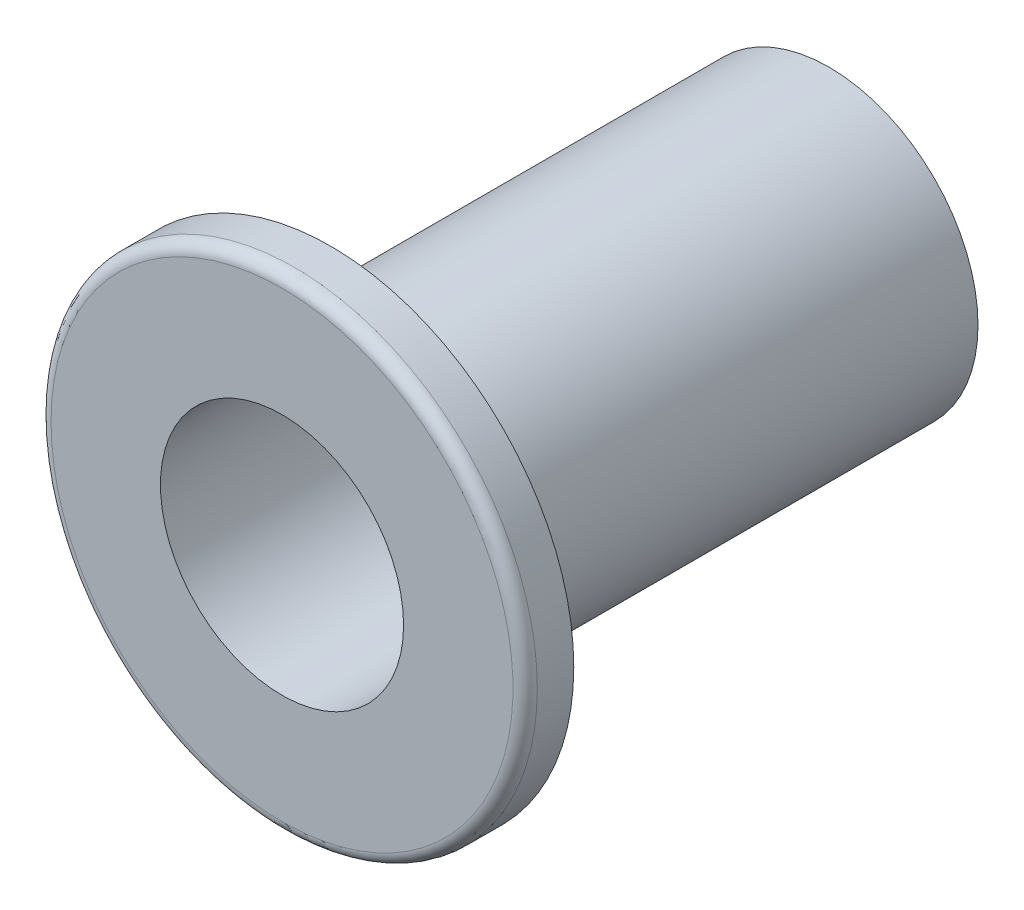
ISO-10303-21;
HEADER;
FILE_DESCRIPTION(('STEP AP214'),'2;1');
FILE_NAME('part.step','',(''),(''),'','','');
FILE_SCHEMA(('AUTOMOTIVE_DESIGN { 1 0 10303 214 1 1 1 1 }'));
ENDSEC;
DATA;
#1=APPLICATION_CONTEXT('core data for automotive mechanical design processes');
#2=APPLICATION_PROTOCOL_DEFINITION('international standard','automotive_design',2000,#1);
#3=PRODUCT_CONTEXT('',#1,'mechanical');
#4=PRODUCT('Part','Part','',(#3));
#5=PRODUCT_RELATED_PRODUCT_CATEGORY('part','',(#4));
#6=PRODUCT_DEFINITION_FORMATION('','',#4);
#7=PRODUCT_DEFINITION_CONTEXT('part definition',#1,'design');
#8=PRODUCT_DEFINITION('design','',#6,#7);
#9=PRODUCT_DEFINITION_SHAPE('','',#8);
#10=(LENGTH_UNIT() NAMED_UNIT(*) SI_UNIT(.MILLI.,.METRE.));
#11=(NAMED_UNIT(*) PLANE_ANGLE_UNIT() SI_UNIT($,.RADIAN.));
#12=(NAMED_UNIT(*) SI_UNIT($,.STERADIAN.) SOLID_ANGLE_UNIT());
#13=UNCERTAINTY_MEASURE_WITH_UNIT(LENGTH_MEASURE(1.E-05),#10,'distance_accuracy_value','');
#14=(GEOMETRIC_REPRESENTATION_CONTEXT(3) GLOBAL_UNCERTAINTY_ASSIGNED_CONTEXT((#13)) GLOBAL_UNIT_ASSIGNED_CONTEXT((#10,
#11,#12)) REPRESENTATION_CONTEXT('',''));
#15=CARTESIAN_POINT('',(0.,0.,0.));
#16=DIRECTION('',(0.,0.,1.));
#17=DIRECTION('',(1.,0.,0.));
#18=AXIS2_PLACEMENT_3D('',#15,#16,#17);
#19=CARTESIAN_POINT('',(0.,0.,0.));
#20=DIRECTION('',(0.,0.,1.));
#21=DIRECTION('',(1.,0.,0.));
#22=AXIS2_PLACEMENT_3D('',#19,#20,#21);
#23=CYLINDRICAL_SURFACE('',#22,4.);
#24=CARTESIAN_POINT('',(0.,0.,0.6));
#25=DIRECTION('',(0.,0.,-1.));
#26=DIRECTION('',(-1.,0.,0.));
#27=AXIS2_PLACEMENT_3D('',#24,#25,#26);
#28=CIRCLE('',#27,4.);
#29=CARTESIAN_POINT('',(-4.,0.,0.6));
#30=VERTEX_POINT('',#29);
#31=EDGE_CURVE('E10',#30,#30,#28,.T.);
#32=ORIENTED_EDGE('',*,*,#31,.T.);
#33=EDGE_LOOP('',(#32));
#34=FACE_BOUND('',#33,.T.);
#35=CARTESIAN_POINT('',(0.,0.,0.));
#36=DIRECTION('',(0.,0.,1.));
#37=DIRECTION('',(1.,0.,0.));
#38=AXIS2_PLACEMENT_3D('',#35,#36,#37);
#39=CIRCLE('',#38,4.);
#40=CARTESIAN_POINT('',(4.,0.,0.));
#41=VERTEX_POINT('',#40);
#42=EDGE_CURVE('E68',#41,#41,#39,.T.);
#43=ORIENTED_EDGE('',*,*,#42,.T.);
#44=EDGE_LOOP('',(#43));
#45=FACE_BOUND('',#44,.T.);
#46=ADVANCED_FACE('F36',(#34,#45),#23,.T.);
#47=CARTESIAN_POINT('',(0.,4.,0.8));
#48=DIRECTION('',(0.,0.,-1.));
#49=DIRECTION('',(-1.,0.,0.));
#50=AXIS2_PLACEMENT_3D('',#47,#48,#49);
#51=PLANE('',#50);
#52=CARTESIAN_POINT('',(0.,0.,0.8));
#53=DIRECTION('',(0.,0.,-1.));
#54=DIRECTION('',(-1.,0.,0.));
#55=AXIS2_PLACEMENT_3D('',#52,#53,#54);
#56=CIRCLE('',#55,3.8);
#57=CARTESIAN_POINT('',(-3.8,0.,0.8));
#58=VERTEX_POINT('',#57);
#59=EDGE_CURVE('E43',#58,#58,#56,.F.);
#60=ORIENTED_EDGE('',*,*,#59,.T.);
#61=EDGE_LOOP('',(#60));
#62=FACE_BOUND('',#61,.T.);
#63=CARTESIAN_POINT('',(0.,0.,0.8));
#64=DIRECTION('',(0.,0.,1.));
#65=DIRECTION('',(1.,0.,0.));
#66=AXIS2_PLACEMENT_3D('',#63,#64,#65);
#67=CIRCLE('',#66,2.);
#68=CARTESIAN_POINT('',(2.,0.,0.8));
#69=VERTEX_POINT('',#68);
#70=EDGE_CURVE('E47',#69,#69,#67,.T.);
#71=ORIENTED_EDGE('',*,*,#70,.F.);
#72=EDGE_LOOP('',(#71));
#73=FACE_BOUND('',#72,.T.);
#74=ADVANCED_FACE('F106',(#62,#73),#51,.F.);
#75=CARTESIAN_POINT('',(0.,0.,0.));
#76=DIRECTION('',(0.,0.,1.));
#77=DIRECTION('',(1.,0.,0.));
#78=AXIS2_PLACEMENT_3D('',#75,#76,#77);
#79=CYLINDRICAL_SURFACE('',#78,2.);
#80=CARTESIAN_POINT('',(0.,0.,-3.7));
#81=DIRECTION('',(0.,0.,1.));
#82=DIRECTION('',(1.,0.,0.));
#83=AXIS2_PLACEMENT_3D('',#80,#81,#82);
#84=CIRCLE('',#83,2.);
#85=CARTESIAN_POINT('',(2.,0.,-3.7));
#86=VERTEX_POINT('',#85);
#87=EDGE_CURVE('E51',#86,#86,#84,.T.);
#88=ORIENTED_EDGE('',*,*,#87,.F.);
#89=EDGE_LOOP('',(#88));
#90=FACE_BOUND('',#89,.T.);
#91=ORIENTED_EDGE('',*,*,#70,.T.);
#92=EDGE_LOOP('',(#91));
#93=FACE_BOUND('',#92,.T.);
#94=ADVANCED_FACE('F100',(#90,#93),#79,.F.);
#95=CARTESIAN_POINT('',(0.,1.5,-3.7));
#96=DIRECTION('',(0.,0.,-1.));
#97=DIRECTION('',(-1.,0.,0.));
#98=AXIS2_PLACEMENT_3D('',#95,#96,#97);
#99=PLANE('',#98);
#100=CARTESIAN_POINT('',(0.,0.,-3.7));
#101=DIRECTION('',(0.,0.,1.));
#102=DIRECTION('',(1.,0.,0.));
#103=AXIS2_PLACEMENT_3D('',#100,#101,#102);
#104=CIRCLE('',#103,1.5);
#105=CARTESIAN_POINT('',(1.5,0.,-3.7));
#106=VERTEX_POINT('',#105);
#107=EDGE_CURVE('E56',#106,#106,#104,.T.);
#108=ORIENTED_EDGE('',*,*,#107,.F.);
#109=EDGE_LOOP('',(#108));
#110=FACE_BOUND('',#109,.T.);
#111=ORIENTED_EDGE('',*,*,#87,.T.);
#112=EDGE_LOOP('',(#111));
#113=FACE_BOUND('',#112,.T.);
#114=ADVANCED_FACE('F94',(#110,#113),#99,.F.);
#115=CARTESIAN_POINT('',(0.,0.,0.));
#116=DIRECTION('',(0.,0.,1.));
#117=DIRECTION('',(1.,0.,0.));
#118=AXIS2_PLACEMENT_3D('',#115,#116,#117);
#119=CYLINDRICAL_SURFACE('',#118,1.5);
#120=CARTESIAN_POINT('',(0.,0.,-8.2));
#121=DIRECTION('',(0.,0.,1.));
#122=DIRECTION('',(1.,0.,0.));
#123=AXIS2_PLACEMENT_3D('',#120,#121,#122);
#124=CIRCLE('',#123,1.5);
#125=CARTESIAN_POINT('',(1.5,0.,-8.2));
#126=VERTEX_POINT('',#125);
#127=EDGE_CURVE('E59',#126,#126,#124,.T.);
#128=ORIENTED_EDGE('',*,*,#127,.F.);
#129=EDGE_LOOP('',(#128));
#130=FACE_BOUND('',#129,.T.);
#131=ORIENTED_EDGE('',*,*,#107,.T.);
#132=EDGE_LOOP('',(#131));
#133=FACE_BOUND('',#132,.T.);
#134=ADVANCED_FACE('F88',(#130,#133),#119,.F.);
#135=CARTESIAN_POINT('',(0.,1.5,-8.2));
#136=DIRECTION('',(0.,0.,1.));
#137=DIRECTION('',(1.,0.,0.));
#138=AXIS2_PLACEMENT_3D('',#135,#136,#137);
#139=PLANE('',#138);
#140=CARTESIAN_POINT('',(0.,0.,-8.2));
#141=DIRECTION('',(0.,0.,1.));
#142=DIRECTION('',(1.,0.,0.));
#143=AXIS2_PLACEMENT_3D('',#140,#141,#142);
#144=CIRCLE('',#143,2.45);
#145=CARTESIAN_POINT('',(2.45,0.,-8.2));
#146=VERTEX_POINT('',#145);
#147=EDGE_CURVE('E62',#146,#146,#144,.T.);
#148=ORIENTED_EDGE('',*,*,#147,.F.);
#149=EDGE_LOOP('',(#148));
#150=FACE_BOUND('',#149,.T.);
#151=ORIENTED_EDGE('',*,*,#127,.T.);
#152=EDGE_LOOP('',(#151));
#153=FACE_BOUND('',#152,.T.);
#154=ADVANCED_FACE('F82',(#150,#153),#139,.F.);
#155=CARTESIAN_POINT('',(0.,0.,0.));
#156=DIRECTION('',(0.,0.,1.));
#157=DIRECTION('',(1.,0.,0.));
#158=AXIS2_PLACEMENT_3D('',#155,#156,#157);
#159=CYLINDRICAL_SURFACE('',#158,2.45);
#160=CARTESIAN_POINT('',(0.,0.,0.));
#161=DIRECTION('',(0.,0.,1.));
#162=DIRECTION('',(1.,0.,0.));
#163=AXIS2_PLACEMENT_3D('',#160,#161,#162);
#164=CIRCLE('',#163,2.45);
#165=CARTESIAN_POINT('',(2.45,0.,0.));
#166=VERTEX_POINT('',#165);
#167=EDGE_CURVE('E65',#166,#166,#164,.T.);
#168=ORIENTED_EDGE('',*,*,#167,.F.);
#169=EDGE_LOOP('',(#168));
#170=FACE_BOUND('',#169,.T.);
#171=ORIENTED_EDGE('',*,*,#147,.T.);
#172=EDGE_LOOP('',(#171));
#173=FACE_BOUND('',#172,.T.);
#174=ADVANCED_FACE('F76',(#170,#173),#159,.T.);
#175=CARTESIAN_POINT('',(0.,2.45,0.));
#176=DIRECTION('',(0.,0.,1.));
#177=DIRECTION('',(1.,0.,0.));
#178=AXIS2_PLACEMENT_3D('',#175,#176,#177);
#179=PLANE('',#178);
#180=ORIENTED_EDGE('',*,*,#42,.F.);
#181=EDGE_LOOP('',(#180));
#182=FACE_BOUND('',#181,.T.);
#183=ORIENTED_EDGE('',*,*,#167,.T.);
#184=EDGE_LOOP('',(#183));
#185=FACE_BOUND('',#184,.T.);
#186=ADVANCED_FACE('F73',(#182,#185),#179,.F.);
#187=CARTESIAN_POINT('',(0.,0.,0.6));
#188=DIRECTION('',(0.,0.,-1.));
#189=DIRECTION('',(-1.,0.,0.));
#190=AXIS2_PLACEMENT_3D('',#187,#188,#189);
#191=TOROIDAL_SURFACE('',#190,3.8,0.2);
#192=ORIENTED_EDGE('',*,*,#31,.F.);
#193=EDGE_LOOP('',(#192));
#194=FACE_BOUND('',#193,.T.);
#195=ORIENTED_EDGE('',*,*,#59,.F.);
#196=EDGE_LOOP('',(#195));
#197=FACE_BOUND('',#196,.T.);
#198=ADVANCED_FACE('F38',(#194,#197),#191,.T.);
#199=CLOSED_SHELL('',(#46,#74,#94,#114,#134,#154,#174,#186,#198));
#200=MANIFOLD_SOLID_BREP('B2',#199);
#201=ADVANCED_BREP_SHAPE_REPRESENTATION('',(#18,#200),#14);
#202=SHAPE_DEFINITION_REPRESENTATION(#9,#201);
ENDSEC;
END-ISO-10303-21;
